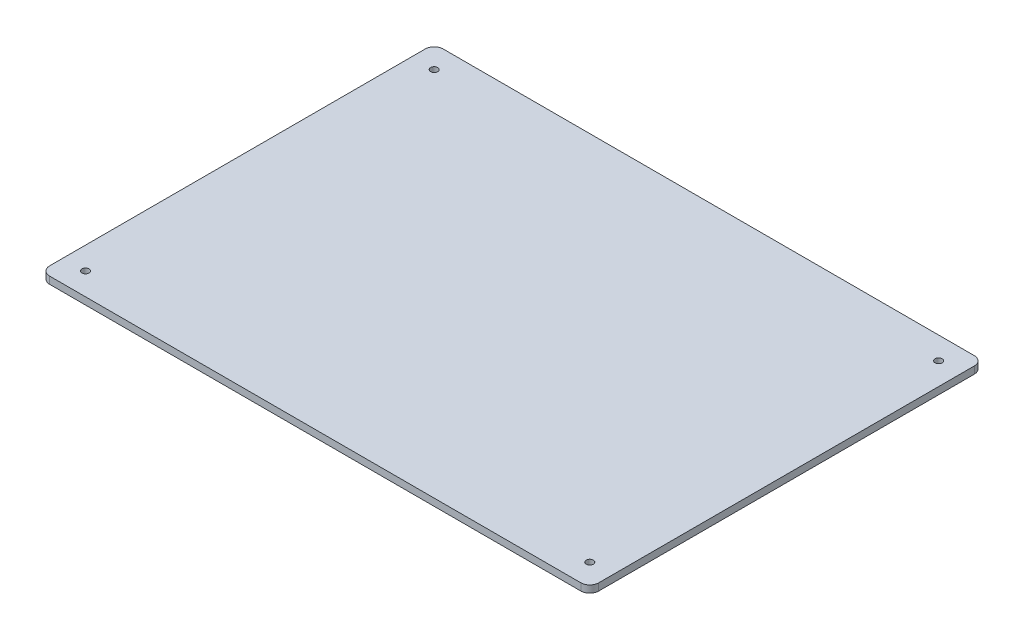
ISO-10303-21;
HEADER;
FILE_DESCRIPTION(('STEP AP214'),'2;1');
FILE_NAME('part.step','',(''),(''),'','','');
FILE_SCHEMA(('AUTOMOTIVE_DESIGN { 1 0 10303 214 1 1 1 1 }'));
ENDSEC;
DATA;
#1=APPLICATION_CONTEXT('core data for automotive mechanical design processes');
#2=APPLICATION_PROTOCOL_DEFINITION('international standard','automotive_design',2000,#1);
#3=PRODUCT_CONTEXT('',#1,'mechanical');
#4=PRODUCT('Part','Part','',(#3));
#5=PRODUCT_RELATED_PRODUCT_CATEGORY('part','',(#4));
#6=PRODUCT_DEFINITION_FORMATION('','',#4);
#7=PRODUCT_DEFINITION_CONTEXT('part definition',#1,'design');
#8=PRODUCT_DEFINITION('design','',#6,#7);
#9=PRODUCT_DEFINITION_SHAPE('','',#8);
#10=(LENGTH_UNIT() NAMED_UNIT(*) SI_UNIT(.MILLI.,.METRE.));
#11=(NAMED_UNIT(*) PLANE_ANGLE_UNIT() SI_UNIT($,.RADIAN.));
#12=(NAMED_UNIT(*) SI_UNIT($,.STERADIAN.) SOLID_ANGLE_UNIT());
#13=UNCERTAINTY_MEASURE_WITH_UNIT(LENGTH_MEASURE(1.E-05),#10,'distance_accuracy_value','');
#14=(GEOMETRIC_REPRESENTATION_CONTEXT(3) GLOBAL_UNCERTAINTY_ASSIGNED_CONTEXT((#13)) GLOBAL_UNIT_ASSIGNED_CONTEXT((#10,
#11,#12)) REPRESENTATION_CONTEXT('',''));
#15=CARTESIAN_POINT('',(0.,0.,0.));
#16=DIRECTION('',(0.,0.,1.));
#17=DIRECTION('',(1.,0.,0.));
#18=AXIS2_PLACEMENT_3D('',#15,#16,#17);
#19=CARTESIAN_POINT('',(148.5,4.,-105.));
#20=DIRECTION('',(0.,-1.,0.));
#21=DIRECTION('',(0.,0.,-1.));
#22=AXIS2_PLACEMENT_3D('',#19,#20,#21);
#23=CYLINDRICAL_SURFACE('',#22,5.);
#24=CARTESIAN_POINT('',(148.5,0.,-105.));
#25=DIRECTION('',(0.,1.,0.));
#26=DIRECTION('',(0.,0.,1.));
#27=AXIS2_PLACEMENT_3D('',#24,#25,#26);
#28=CIRCLE('',#27,5.);
#29=CARTESIAN_POINT('',(153.5,0.,-105.));
#30=VERTEX_POINT('',#29);
#31=CARTESIAN_POINT('',(148.5,0.,-110.));
#32=VERTEX_POINT('',#31);
#33=EDGE_CURVE('E129',#30,#32,#28,.T.);
#34=ORIENTED_EDGE('',*,*,#33,.T.);
#35=DIRECTION('',(0.,-1.,0.));
#36=VECTOR('',#35,1.);
#37=CARTESIAN_POINT('',(148.5,4.,-110.));
#38=LINE('',#37,#36);
#39=CARTESIAN_POINT('',(148.5,4.,-110.));
#40=VERTEX_POINT('',#39);
#41=EDGE_CURVE('E11',#40,#32,#38,.T.);
#42=ORIENTED_EDGE('',*,*,#41,.F.);
#43=CARTESIAN_POINT('',(148.5,4.,-105.));
#44=DIRECTION('',(0.,1.,0.));
#45=DIRECTION('',(0.,0.,1.));
#46=AXIS2_PLACEMENT_3D('',#43,#44,#45);
#47=CIRCLE('',#46,5.);
#48=CARTESIAN_POINT('',(153.5,4.,-105.));
#49=VERTEX_POINT('',#48);
#50=EDGE_CURVE('E144',#49,#40,#47,.T.);
#51=ORIENTED_EDGE('',*,*,#50,.F.);
#52=DIRECTION('',(0.,-1.,0.));
#53=VECTOR('',#52,1.);
#54=CARTESIAN_POINT('',(153.5,4.,-105.));
#55=LINE('',#54,#53);
#56=EDGE_CURVE('E125',#49,#30,#55,.T.);
#57=ORIENTED_EDGE('',*,*,#56,.T.);
#58=EDGE_LOOP('',(#34,#42,#51,#57));
#59=FACE_BOUND('',#58,.T.);
#60=ADVANCED_FACE('F33',(#59),#23,.T.);
#61=CARTESIAN_POINT('',(148.5,4.,-110.));
#62=DIRECTION('',(0.,0.,1.));
#63=DIRECTION('',(1.,0.,0.));
#64=AXIS2_PLACEMENT_3D('',#61,#62,#63);
#65=PLANE('',#64);
#66=DIRECTION('',(-1.,0.,0.));
#67=VECTOR('',#66,1.);
#68=CARTESIAN_POINT('',(148.5,0.,-110.));
#69=LINE('',#68,#67);
#70=CARTESIAN_POINT('',(-148.5,0.,-110.));
#71=VERTEX_POINT('',#70);
#72=EDGE_CURVE('E132',#32,#71,#69,.T.);
#73=ORIENTED_EDGE('',*,*,#72,.T.);
#74=DIRECTION('',(0.,-1.,0.));
#75=VECTOR('',#74,1.);
#76=CARTESIAN_POINT('',(-148.5,4.,-110.));
#77=LINE('',#76,#75);
#78=CARTESIAN_POINT('',(-148.5,4.,-110.));
#79=VERTEX_POINT('',#78);
#80=EDGE_CURVE('E41',#79,#71,#77,.T.);
#81=ORIENTED_EDGE('',*,*,#80,.F.);
#82=DIRECTION('',(-1.,0.,0.));
#83=VECTOR('',#82,1.);
#84=CARTESIAN_POINT('',(148.5,4.,-110.));
#85=LINE('',#84,#83);
#86=EDGE_CURVE('E92',#40,#79,#85,.T.);
#87=ORIENTED_EDGE('',*,*,#86,.F.);
#88=ORIENTED_EDGE('',*,*,#41,.T.);
#89=EDGE_LOOP('',(#73,#81,#87,#88));
#90=FACE_BOUND('',#89,.T.);
#91=ADVANCED_FACE('F229',(#90),#65,.F.);
#92=CARTESIAN_POINT('',(-148.5,4.,-105.));
#93=DIRECTION('',(0.,-1.,0.));
#94=DIRECTION('',(0.,0.,-1.));
#95=AXIS2_PLACEMENT_3D('',#92,#93,#94);
#96=CYLINDRICAL_SURFACE('',#95,5.);
#97=CARTESIAN_POINT('',(-148.5,0.,-105.));
#98=DIRECTION('',(0.,1.,0.));
#99=DIRECTION('',(0.,0.,1.));
#100=AXIS2_PLACEMENT_3D('',#97,#98,#99);
#101=CIRCLE('',#100,5.);
#102=CARTESIAN_POINT('',(-153.5,0.,-105.));
#103=VERTEX_POINT('',#102);
#104=EDGE_CURVE('E135',#71,#103,#101,.T.);
#105=ORIENTED_EDGE('',*,*,#104,.T.);
#106=DIRECTION('',(0.,-1.,0.));
#107=VECTOR('',#106,1.);
#108=CARTESIAN_POINT('',(-153.5,4.,-105.));
#109=LINE('',#108,#107);
#110=CARTESIAN_POINT('',(-153.5,4.,-105.));
#111=VERTEX_POINT('',#110);
#112=EDGE_CURVE('E151',#111,#103,#109,.T.);
#113=ORIENTED_EDGE('',*,*,#112,.F.);
#114=CARTESIAN_POINT('',(-148.5,4.,-105.));
#115=DIRECTION('',(0.,1.,0.));
#116=DIRECTION('',(0.,0.,1.));
#117=AXIS2_PLACEMENT_3D('',#114,#115,#116);
#118=CIRCLE('',#117,5.);
#119=EDGE_CURVE('E159',#79,#111,#118,.T.);
#120=ORIENTED_EDGE('',*,*,#119,.F.);
#121=ORIENTED_EDGE('',*,*,#80,.T.);
#122=EDGE_LOOP('',(#105,#113,#120,#121));
#123=FACE_BOUND('',#122,.T.);
#124=ADVANCED_FACE('F157',(#123),#96,.T.);
#125=CARTESIAN_POINT('',(-153.5,4.,105.));
#126=DIRECTION('',(1.,0.,0.));
#127=DIRECTION('',(0.,0.,-1.));
#128=AXIS2_PLACEMENT_3D('',#125,#126,#127);
#129=PLANE('',#128);
#130=DIRECTION('',(0.,0.,1.));
#131=VECTOR('',#130,1.);
#132=CARTESIAN_POINT('',(-153.5,0.,105.));
#133=LINE('',#132,#131);
#134=CARTESIAN_POINT('',(-153.5,0.,105.));
#135=VERTEX_POINT('',#134);
#136=EDGE_CURVE('E137',#103,#135,#133,.T.);
#137=ORIENTED_EDGE('',*,*,#136,.T.);
#138=DIRECTION('',(0.,-1.,0.));
#139=VECTOR('',#138,1.);
#140=CARTESIAN_POINT('',(-153.5,4.,105.));
#141=LINE('',#140,#139);
#142=CARTESIAN_POINT('',(-153.5,4.,105.));
#143=VERTEX_POINT('',#142);
#144=EDGE_CURVE('E148',#143,#135,#141,.T.);
#145=ORIENTED_EDGE('',*,*,#144,.F.);
#146=DIRECTION('',(0.,0.,1.));
#147=VECTOR('',#146,1.);
#148=CARTESIAN_POINT('',(-153.5,4.,105.));
#149=LINE('',#148,#147);
#150=EDGE_CURVE('E171',#111,#143,#149,.T.);
#151=ORIENTED_EDGE('',*,*,#150,.F.);
#152=ORIENTED_EDGE('',*,*,#112,.T.);
#153=EDGE_LOOP('',(#137,#145,#151,#152));
#154=FACE_BOUND('',#153,.T.);
#155=ADVANCED_FACE('F167',(#154),#129,.F.);
#156=CARTESIAN_POINT('',(-148.5,4.,105.));
#157=DIRECTION('',(0.,-1.,0.));
#158=DIRECTION('',(0.,0.,-1.));
#159=AXIS2_PLACEMENT_3D('',#156,#157,#158);
#160=CYLINDRICAL_SURFACE('',#159,5.);
#161=CARTESIAN_POINT('',(-148.5,0.,105.));
#162=DIRECTION('',(0.,1.,0.));
#163=DIRECTION('',(0.,0.,-1.));
#164=AXIS2_PLACEMENT_3D('',#161,#162,#163);
#165=CIRCLE('',#164,5.);
#166=CARTESIAN_POINT('',(-148.5,0.,110.));
#167=VERTEX_POINT('',#166);
#168=EDGE_CURVE('E139',#135,#167,#165,.T.);
#169=ORIENTED_EDGE('',*,*,#168,.T.);
#170=DIRECTION('',(0.,-1.,0.));
#171=VECTOR('',#170,1.);
#172=CARTESIAN_POINT('',(-148.5,4.,110.));
#173=LINE('',#172,#171);
#174=CARTESIAN_POINT('',(-148.5,4.,110.));
#175=VERTEX_POINT('',#174);
#176=EDGE_CURVE('E120',#175,#167,#173,.T.);
#177=ORIENTED_EDGE('',*,*,#176,.F.);
#178=CARTESIAN_POINT('',(-148.5,4.,105.));
#179=DIRECTION('',(0.,1.,0.));
#180=DIRECTION('',(0.,0.,-1.));
#181=AXIS2_PLACEMENT_3D('',#178,#179,#180);
#182=CIRCLE('',#181,5.);
#183=EDGE_CURVE('E111',#143,#175,#182,.T.);
#184=ORIENTED_EDGE('',*,*,#183,.F.);
#185=ORIENTED_EDGE('',*,*,#144,.T.);
#186=EDGE_LOOP('',(#169,#177,#184,#185));
#187=FACE_BOUND('',#186,.T.);
#188=ADVANCED_FACE('F170',(#187),#160,.T.);
#189=CARTESIAN_POINT('',(148.5,4.,110.));
#190=DIRECTION('',(0.,0.,-1.));
#191=DIRECTION('',(-1.,0.,0.));
#192=AXIS2_PLACEMENT_3D('',#189,#190,#191);
#193=PLANE('',#192);
#194=DIRECTION('',(1.,0.,0.));
#195=VECTOR('',#194,1.);
#196=CARTESIAN_POINT('',(148.5,0.,110.));
#197=LINE('',#196,#195);
#198=CARTESIAN_POINT('',(148.5,0.,110.));
#199=VERTEX_POINT('',#198);
#200=EDGE_CURVE('E119',#167,#199,#197,.T.);
#201=ORIENTED_EDGE('',*,*,#200,.T.);
#202=DIRECTION('',(0.,-1.,0.));
#203=VECTOR('',#202,1.);
#204=CARTESIAN_POINT('',(148.5,4.,110.));
#205=LINE('',#204,#203);
#206=CARTESIAN_POINT('',(148.5,4.,110.));
#207=VERTEX_POINT('',#206);
#208=EDGE_CURVE('E116',#207,#199,#205,.T.);
#209=ORIENTED_EDGE('',*,*,#208,.F.);
#210=DIRECTION('',(1.,0.,0.));
#211=VECTOR('',#210,1.);
#212=CARTESIAN_POINT('',(148.5,4.,110.));
#213=LINE('',#212,#211);
#214=EDGE_CURVE('E105',#175,#207,#213,.T.);
#215=ORIENTED_EDGE('',*,*,#214,.F.);
#216=ORIENTED_EDGE('',*,*,#176,.T.);
#217=EDGE_LOOP('',(#201,#209,#215,#216));
#218=FACE_BOUND('',#217,.T.);
#219=ADVANCED_FACE('F117',(#218),#193,.F.);
#220=CARTESIAN_POINT('',(148.5,4.,105.));
#221=DIRECTION('',(0.,-1.,0.));
#222=DIRECTION('',(0.,0.,-1.));
#223=AXIS2_PLACEMENT_3D('',#220,#221,#222);
#224=CYLINDRICAL_SURFACE('',#223,5.);
#225=CARTESIAN_POINT('',(148.5,0.,105.));
#226=DIRECTION('',(0.,1.,0.));
#227=DIRECTION('',(0.,0.,1.));
#228=AXIS2_PLACEMENT_3D('',#225,#226,#227);
#229=CIRCLE('',#228,5.);
#230=CARTESIAN_POINT('',(153.5,0.,105.));
#231=VERTEX_POINT('',#230);
#232=EDGE_CURVE('E78',#199,#231,#229,.T.);
#233=ORIENTED_EDGE('',*,*,#232,.T.);
#234=DIRECTION('',(0.,-1.,0.));
#235=VECTOR('',#234,1.);
#236=CARTESIAN_POINT('',(153.5,4.,105.));
#237=LINE('',#236,#235);
#238=CARTESIAN_POINT('',(153.5,4.,105.));
#239=VERTEX_POINT('',#238);
#240=EDGE_CURVE('E121',#239,#231,#237,.T.);
#241=ORIENTED_EDGE('',*,*,#240,.F.);
#242=CARTESIAN_POINT('',(148.5,4.,105.));
#243=DIRECTION('',(0.,1.,0.));
#244=DIRECTION('',(0.,0.,1.));
#245=AXIS2_PLACEMENT_3D('',#242,#243,#244);
#246=CIRCLE('',#245,5.);
#247=EDGE_CURVE('E109',#207,#239,#246,.T.);
#248=ORIENTED_EDGE('',*,*,#247,.F.);
#249=ORIENTED_EDGE('',*,*,#208,.T.);
#250=EDGE_LOOP('',(#233,#241,#248,#249));
#251=FACE_BOUND('',#250,.T.);
#252=ADVANCED_FACE('F123',(#251),#224,.T.);
#253=CARTESIAN_POINT('',(153.5,4.,105.));
#254=DIRECTION('',(-1.,0.,0.));
#255=DIRECTION('',(0.,0.,1.));
#256=AXIS2_PLACEMENT_3D('',#253,#254,#255);
#257=PLANE('',#256);
#258=DIRECTION('',(0.,0.,-1.));
#259=VECTOR('',#258,1.);
#260=CARTESIAN_POINT('',(153.5,0.,105.));
#261=LINE('',#260,#259);
#262=EDGE_CURVE('E84',#231,#30,#261,.T.);
#263=ORIENTED_EDGE('',*,*,#262,.T.);
#264=ORIENTED_EDGE('',*,*,#56,.F.);
#265=DIRECTION('',(0.,0.,-1.));
#266=VECTOR('',#265,1.);
#267=CARTESIAN_POINT('',(153.5,4.,105.));
#268=LINE('',#267,#266);
#269=EDGE_CURVE('E49',#239,#49,#268,.T.);
#270=ORIENTED_EDGE('',*,*,#269,.F.);
#271=ORIENTED_EDGE('',*,*,#240,.T.);
#272=EDGE_LOOP('',(#263,#264,#270,#271));
#273=FACE_BOUND('',#272,.T.);
#274=ADVANCED_FACE('F205',(#273),#257,.F.);
#275=CARTESIAN_POINT('',(148.5,4.,-105.));
#276=DIRECTION('',(0.,1.,0.));
#277=DIRECTION('',(0.,0.,1.));
#278=AXIS2_PLACEMENT_3D('',#275,#276,#277);
#279=PLANE('',#278);
#280=CARTESIAN_POINT('',(-141.,4.,-97.5));
#281=DIRECTION('',(0.,1.,0.));
#282=DIRECTION('',(0.,0.,1.));
#283=AXIS2_PLACEMENT_3D('',#280,#281,#282);
#284=CIRCLE('',#283,2.);
#285=CARTESIAN_POINT('',(-141.,4.,-95.5));
#286=VERTEX_POINT('',#285);
#287=EDGE_CURVE('E197',#286,#286,#284,.T.);
#288=ORIENTED_EDGE('',*,*,#287,.F.);
#289=EDGE_LOOP('',(#288));
#290=FACE_BOUND('',#289,.T.);
#291=CARTESIAN_POINT('',(-141.,4.,97.5));
#292=DIRECTION('',(0.,1.,0.));
#293=DIRECTION('',(0.,0.,1.));
#294=AXIS2_PLACEMENT_3D('',#291,#292,#293);
#295=CIRCLE('',#294,2.);
#296=CARTESIAN_POINT('',(-141.,4.,99.5));
#297=VERTEX_POINT('',#296);
#298=EDGE_CURVE('E191',#297,#297,#295,.T.);
#299=ORIENTED_EDGE('',*,*,#298,.F.);
#300=EDGE_LOOP('',(#299));
#301=FACE_BOUND('',#300,.T.);
#302=CARTESIAN_POINT('',(141.,4.,97.5));
#303=DIRECTION('',(0.,1.,0.));
#304=DIRECTION('',(0.,0.,1.));
#305=AXIS2_PLACEMENT_3D('',#302,#303,#304);
#306=CIRCLE('',#305,2.);
#307=CARTESIAN_POINT('',(141.,4.,99.5));
#308=VERTEX_POINT('',#307);
#309=EDGE_CURVE('E185',#308,#308,#306,.T.);
#310=ORIENTED_EDGE('',*,*,#309,.F.);
#311=EDGE_LOOP('',(#310));
#312=FACE_BOUND('',#311,.T.);
#313=CARTESIAN_POINT('',(141.,4.,-97.5));
#314=DIRECTION('',(0.,1.,0.));
#315=DIRECTION('',(0.,0.,1.));
#316=AXIS2_PLACEMENT_3D('',#313,#314,#315);
#317=CIRCLE('',#316,2.);
#318=CARTESIAN_POINT('',(141.,4.,-95.5));
#319=VERTEX_POINT('',#318);
#320=EDGE_CURVE('E179',#319,#319,#317,.T.);
#321=ORIENTED_EDGE('',*,*,#320,.F.);
#322=EDGE_LOOP('',(#321));
#323=FACE_BOUND('',#322,.T.);
#324=ORIENTED_EDGE('',*,*,#50,.T.);
#325=ORIENTED_EDGE('',*,*,#86,.T.);
#326=ORIENTED_EDGE('',*,*,#119,.T.);
#327=ORIENTED_EDGE('',*,*,#150,.T.);
#328=ORIENTED_EDGE('',*,*,#183,.T.);
#329=ORIENTED_EDGE('',*,*,#214,.T.);
#330=ORIENTED_EDGE('',*,*,#247,.T.);
#331=ORIENTED_EDGE('',*,*,#269,.T.);
#332=EDGE_LOOP('',(#324,#325,#326,#327,#328,#329,#330,#331));
#333=FACE_BOUND('',#332,.T.);
#334=ADVANCED_FACE('F107',(#290,#301,#312,#323,#333),#279,.T.);
#335=CARTESIAN_POINT('',(148.5,0.,-105.));
#336=DIRECTION('',(0.,1.,0.));
#337=DIRECTION('',(0.,0.,1.));
#338=AXIS2_PLACEMENT_3D('',#335,#336,#337);
#339=PLANE('',#338);
#340=CARTESIAN_POINT('',(-141.,0.,-97.5));
#341=DIRECTION('',(0.,1.,0.));
#342=DIRECTION('',(0.,0.,1.));
#343=AXIS2_PLACEMENT_3D('',#340,#341,#342);
#344=CIRCLE('',#343,2.);
#345=CARTESIAN_POINT('',(-141.,0.,-95.5));
#346=VERTEX_POINT('',#345);
#347=EDGE_CURVE('E194',#346,#346,#344,.T.);
#348=ORIENTED_EDGE('',*,*,#347,.T.);
#349=EDGE_LOOP('',(#348));
#350=FACE_BOUND('',#349,.T.);
#351=CARTESIAN_POINT('',(-141.,0.,97.5));
#352=DIRECTION('',(0.,1.,0.));
#353=DIRECTION('',(0.,0.,1.));
#354=AXIS2_PLACEMENT_3D('',#351,#352,#353);
#355=CIRCLE('',#354,2.);
#356=CARTESIAN_POINT('',(-141.,0.,99.5));
#357=VERTEX_POINT('',#356);
#358=EDGE_CURVE('E188',#357,#357,#355,.T.);
#359=ORIENTED_EDGE('',*,*,#358,.T.);
#360=EDGE_LOOP('',(#359));
#361=FACE_BOUND('',#360,.T.);
#362=CARTESIAN_POINT('',(141.,0.,97.5));
#363=DIRECTION('',(0.,1.,0.));
#364=DIRECTION('',(0.,0.,1.));
#365=AXIS2_PLACEMENT_3D('',#362,#363,#364);
#366=CIRCLE('',#365,2.);
#367=CARTESIAN_POINT('',(141.,0.,99.5));
#368=VERTEX_POINT('',#367);
#369=EDGE_CURVE('E182',#368,#368,#366,.T.);
#370=ORIENTED_EDGE('',*,*,#369,.T.);
#371=EDGE_LOOP('',(#370));
#372=FACE_BOUND('',#371,.T.);
#373=CARTESIAN_POINT('',(141.,0.,-97.5));
#374=DIRECTION('',(0.,1.,0.));
#375=DIRECTION('',(0.,0.,1.));
#376=AXIS2_PLACEMENT_3D('',#373,#374,#375);
#377=CIRCLE('',#376,2.);
#378=CARTESIAN_POINT('',(141.,0.,-95.5));
#379=VERTEX_POINT('',#378);
#380=EDGE_CURVE('E133',#379,#379,#377,.T.);
#381=ORIENTED_EDGE('',*,*,#380,.T.);
#382=EDGE_LOOP('',(#381));
#383=FACE_BOUND('',#382,.T.);
#384=ORIENTED_EDGE('',*,*,#33,.F.);
#385=ORIENTED_EDGE('',*,*,#262,.F.);
#386=ORIENTED_EDGE('',*,*,#232,.F.);
#387=ORIENTED_EDGE('',*,*,#200,.F.);
#388=ORIENTED_EDGE('',*,*,#168,.F.);
#389=ORIENTED_EDGE('',*,*,#136,.F.);
#390=ORIENTED_EDGE('',*,*,#104,.F.);
#391=ORIENTED_EDGE('',*,*,#72,.F.);
#392=EDGE_LOOP('',(#384,#385,#386,#387,#388,#389,#390,#391));
#393=FACE_BOUND('',#392,.T.);
#394=ADVANCED_FACE('F163',(#350,#361,#372,#383,#393),#339,.F.);
#395=CARTESIAN_POINT('',(141.,4.,-97.5));
#396=DIRECTION('',(0.,1.,0.));
#397=DIRECTION('',(0.,0.,1.));
#398=AXIS2_PLACEMENT_3D('',#395,#396,#397);
#399=CYLINDRICAL_SURFACE('',#398,2.);
#400=ORIENTED_EDGE('',*,*,#380,.F.);
#401=EDGE_LOOP('',(#400));
#402=FACE_BOUND('',#401,.T.);
#403=ORIENTED_EDGE('',*,*,#320,.T.);
#404=EDGE_LOOP('',(#403));
#405=FACE_BOUND('',#404,.T.);
#406=ADVANCED_FACE('F213',(#402,#405),#399,.F.);
#407=CARTESIAN_POINT('',(141.,4.,97.5));
#408=DIRECTION('',(0.,1.,0.));
#409=DIRECTION('',(0.,0.,1.));
#410=AXIS2_PLACEMENT_3D('',#407,#408,#409);
#411=CYLINDRICAL_SURFACE('',#410,2.);
#412=ORIENTED_EDGE('',*,*,#369,.F.);
#413=EDGE_LOOP('',(#412));
#414=FACE_BOUND('',#413,.T.);
#415=ORIENTED_EDGE('',*,*,#309,.T.);
#416=EDGE_LOOP('',(#415));
#417=FACE_BOUND('',#416,.T.);
#418=ADVANCED_FACE('F215',(#414,#417),#411,.F.);
#419=CARTESIAN_POINT('',(-141.,4.,97.5));
#420=DIRECTION('',(0.,1.,0.));
#421=DIRECTION('',(0.,0.,1.));
#422=AXIS2_PLACEMENT_3D('',#419,#420,#421);
#423=CYLINDRICAL_SURFACE('',#422,2.);
#424=ORIENTED_EDGE('',*,*,#358,.F.);
#425=EDGE_LOOP('',(#424));
#426=FACE_BOUND('',#425,.T.);
#427=ORIENTED_EDGE('',*,*,#298,.T.);
#428=EDGE_LOOP('',(#427));
#429=FACE_BOUND('',#428,.T.);
#430=ADVANCED_FACE('F222',(#426,#429),#423,.F.);
#431=CARTESIAN_POINT('',(-141.,4.,-97.5));
#432=DIRECTION('',(0.,1.,0.));
#433=DIRECTION('',(0.,0.,1.));
#434=AXIS2_PLACEMENT_3D('',#431,#432,#433);
#435=CYLINDRICAL_SURFACE('',#434,2.);
#436=ORIENTED_EDGE('',*,*,#347,.F.);
#437=EDGE_LOOP('',(#436));
#438=FACE_BOUND('',#437,.T.);
#439=ORIENTED_EDGE('',*,*,#287,.T.);
#440=EDGE_LOOP('',(#439));
#441=FACE_BOUND('',#440,.T.);
#442=ADVANCED_FACE('F201',(#438,#441),#435,.F.);
#443=CLOSED_SHELL('',(#60,#91,#124,#155,#188,#219,#252,#274,#334,#394,#406,#418,#430,#442));
#444=MANIFOLD_SOLID_BREP('B2',#443);
#445=ADVANCED_BREP_SHAPE_REPRESENTATION('',(#18,#444),#14);
#446=SHAPE_DEFINITION_REPRESENTATION(#9,#445);
ENDSEC;
END-ISO-10303-21;
